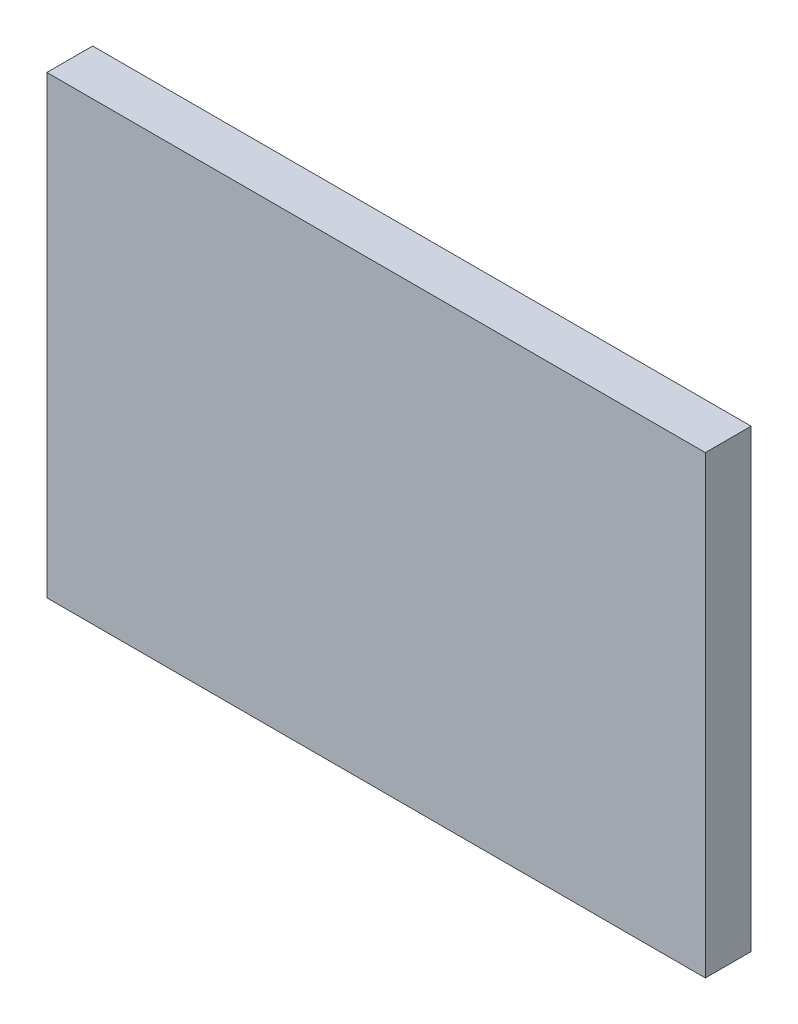
ISO-10303-21;
HEADER;
FILE_DESCRIPTION(('STEP AP214'),'2;1');
FILE_NAME('part.step','',(''),(''),'','','');
FILE_SCHEMA(('AUTOMOTIVE_DESIGN { 1 0 10303 214 1 1 1 1 }'));
ENDSEC;
DATA;
#1=APPLICATION_CONTEXT('core data for automotive mechanical design processes');
#2=APPLICATION_PROTOCOL_DEFINITION('international standard','automotive_design',2000,#1);
#3=PRODUCT_CONTEXT('',#1,'mechanical');
#4=PRODUCT('Part','Part','',(#3));
#5=PRODUCT_RELATED_PRODUCT_CATEGORY('part','',(#4));
#6=PRODUCT_DEFINITION_FORMATION('','',#4);
#7=PRODUCT_DEFINITION_CONTEXT('part definition',#1,'design');
#8=PRODUCT_DEFINITION('design','',#6,#7);
#9=PRODUCT_DEFINITION_SHAPE('','',#8);
#10=(LENGTH_UNIT() NAMED_UNIT(*) SI_UNIT(.MILLI.,.METRE.));
#11=(NAMED_UNIT(*) PLANE_ANGLE_UNIT() SI_UNIT($,.RADIAN.));
#12=(NAMED_UNIT(*) SI_UNIT($,.STERADIAN.) SOLID_ANGLE_UNIT());
#13=UNCERTAINTY_MEASURE_WITH_UNIT(LENGTH_MEASURE(1.E-05),#10,'distance_accuracy_value','');
#14=(GEOMETRIC_REPRESENTATION_CONTEXT(3) GLOBAL_UNCERTAINTY_ASSIGNED_CONTEXT((#13)) GLOBAL_UNIT_ASSIGNED_CONTEXT((#10,
#11,#12)) REPRESENTATION_CONTEXT('',''));
#15=CARTESIAN_POINT('',(0.,0.,0.));
#16=DIRECTION('',(0.,0.,1.));
#17=DIRECTION('',(1.,0.,0.));
#18=AXIS2_PLACEMENT_3D('',#15,#16,#17);
#19=CARTESIAN_POINT('',(-18.7752078077315,18.3648207518248,2.54));
#20=DIRECTION('',(1.,0.,0.));
#21=DIRECTION('',(0.,0.,-1.));
#22=AXIS2_PLACEMENT_3D('',#19,#20,#21);
#23=PLANE('',#22);
#24=DIRECTION('',(0.,-1.,0.));
#25=VECTOR('',#24,1.);
#26=CARTESIAN_POINT('',(-18.7752078077315,18.3648207518248,0.));
#27=LINE('',#26,#25);
#28=CARTESIAN_POINT('',(-18.7752078077315,18.3648207518248,0.));
#29=VERTEX_POINT('',#28);
#30=CARTESIAN_POINT('',(-18.7752078077315,-6.87398318643723,0.));
#31=VERTEX_POINT('',#30);
#32=EDGE_CURVE('E101',#29,#31,#27,.T.);
#33=ORIENTED_EDGE('',*,*,#32,.T.);
#34=DIRECTION('',(0.,0.,-1.));
#35=VECTOR('',#34,1.);
#36=CARTESIAN_POINT('',(-18.7752078077315,-6.87398318643723,2.54));
#37=LINE('',#36,#35);
#38=CARTESIAN_POINT('',(-18.7752078077315,-6.87398318643723,2.54));
#39=VERTEX_POINT('',#38);
#40=EDGE_CURVE('E11',#39,#31,#37,.T.);
#41=ORIENTED_EDGE('',*,*,#40,.F.);
#42=DIRECTION('',(0.,-1.,0.));
#43=VECTOR('',#42,1.);
#44=CARTESIAN_POINT('',(-18.7752078077315,18.3648207518248,2.54));
#45=LINE('',#44,#43);
#46=CARTESIAN_POINT('',(-18.7752078077315,18.3648207518248,2.54));
#47=VERTEX_POINT('',#46);
#48=EDGE_CURVE('E89',#47,#39,#45,.T.);
#49=ORIENTED_EDGE('',*,*,#48,.F.);
#50=DIRECTION('',(0.,0.,-1.));
#51=VECTOR('',#50,1.);
#52=CARTESIAN_POINT('',(-18.7752078077315,18.3648207518248,2.54));
#53=LINE('',#52,#51);
#54=EDGE_CURVE('E97',#47,#29,#53,.T.);
#55=ORIENTED_EDGE('',*,*,#54,.T.);
#56=EDGE_LOOP('',(#33,#41,#49,#55));
#57=FACE_BOUND('',#56,.T.);
#58=ADVANCED_FACE('F38',(#57),#23,.F.);
#59=CARTESIAN_POINT('',(-18.7752078077315,-6.87398318643723,2.54));
#60=DIRECTION('',(0.,1.,0.));
#61=DIRECTION('',(0.,0.,1.));
#62=AXIS2_PLACEMENT_3D('',#59,#60,#61);
#63=PLANE('',#62);
#64=DIRECTION('',(1.,0.,0.));
#65=VECTOR('',#64,1.);
#66=CARTESIAN_POINT('',(-18.7752078077315,-6.87398318643723,0.));
#67=LINE('',#66,#65);
#68=CARTESIAN_POINT('',(17.7492401679648,-6.87398318643723,0.));
#69=VERTEX_POINT('',#68);
#70=EDGE_CURVE('E93',#31,#69,#67,.T.);
#71=ORIENTED_EDGE('',*,*,#70,.T.);
#72=DIRECTION('',(0.,0.,-1.));
#73=VECTOR('',#72,1.);
#74=CARTESIAN_POINT('',(17.7492401679648,-6.87398318643723,2.54));
#75=LINE('',#74,#73);
#76=CARTESIAN_POINT('',(17.7492401679648,-6.87398318643723,2.54));
#77=VERTEX_POINT('',#76);
#78=EDGE_CURVE('E46',#77,#69,#75,.T.);
#79=ORIENTED_EDGE('',*,*,#78,.F.);
#80=DIRECTION('',(1.,0.,0.));
#81=VECTOR('',#80,1.);
#82=CARTESIAN_POINT('',(-18.7752078077315,-6.87398318643723,2.54));
#83=LINE('',#82,#81);
#84=EDGE_CURVE('E84',#39,#77,#83,.T.);
#85=ORIENTED_EDGE('',*,*,#84,.F.);
#86=ORIENTED_EDGE('',*,*,#40,.T.);
#87=EDGE_LOOP('',(#71,#79,#85,#86));
#88=FACE_BOUND('',#87,.T.);
#89=ADVANCED_FACE('F92',(#88),#63,.F.);
#90=CARTESIAN_POINT('',(17.7492401679648,18.3648207518248,2.54));
#91=DIRECTION('',(-1.,0.,0.));
#92=DIRECTION('',(0.,0.,1.));
#93=AXIS2_PLACEMENT_3D('',#90,#91,#92);
#94=PLANE('',#93);
#95=DIRECTION('',(0.,1.,0.));
#96=VECTOR('',#95,1.);
#97=CARTESIAN_POINT('',(17.7492401679648,18.3648207518248,0.));
#98=LINE('',#97,#96);
#99=CARTESIAN_POINT('',(17.7492401679648,18.3648207518248,0.));
#100=VERTEX_POINT('',#99);
#101=EDGE_CURVE('E71',#69,#100,#98,.T.);
#102=ORIENTED_EDGE('',*,*,#101,.T.);
#103=DIRECTION('',(0.,0.,-1.));
#104=VECTOR('',#103,1.);
#105=CARTESIAN_POINT('',(17.7492401679648,18.3648207518248,2.54));
#106=LINE('',#105,#104);
#107=CARTESIAN_POINT('',(17.7492401679648,18.3648207518248,2.54));
#108=VERTEX_POINT('',#107);
#109=EDGE_CURVE('E94',#108,#100,#106,.T.);
#110=ORIENTED_EDGE('',*,*,#109,.F.);
#111=DIRECTION('',(0.,1.,0.));
#112=VECTOR('',#111,1.);
#113=CARTESIAN_POINT('',(17.7492401679648,18.3648207518248,2.54));
#114=LINE('',#113,#112);
#115=EDGE_CURVE('E87',#77,#108,#114,.T.);
#116=ORIENTED_EDGE('',*,*,#115,.F.);
#117=ORIENTED_EDGE('',*,*,#78,.T.);
#118=EDGE_LOOP('',(#102,#110,#116,#117));
#119=FACE_BOUND('',#118,.T.);
#120=ADVANCED_FACE('F95',(#119),#94,.F.);
#121=CARTESIAN_POINT('',(-18.7752078077315,18.3648207518248,2.54));
#122=DIRECTION('',(0.,-1.,0.));
#123=DIRECTION('',(0.,0.,-1.));
#124=AXIS2_PLACEMENT_3D('',#121,#122,#123);
#125=PLANE('',#124);
#126=DIRECTION('',(-1.,0.,0.));
#127=VECTOR('',#126,1.);
#128=CARTESIAN_POINT('',(-18.7752078077315,18.3648207518248,0.));
#129=LINE('',#128,#127);
#130=EDGE_CURVE('E77',#100,#29,#129,.T.);
#131=ORIENTED_EDGE('',*,*,#130,.T.);
#132=ORIENTED_EDGE('',*,*,#54,.F.);
#133=DIRECTION('',(-1.,0.,0.));
#134=VECTOR('',#133,1.);
#135=CARTESIAN_POINT('',(-18.7752078077315,18.3648207518248,2.54));
#136=LINE('',#135,#134);
#137=EDGE_CURVE('E54',#108,#47,#136,.T.);
#138=ORIENTED_EDGE('',*,*,#137,.F.);
#139=ORIENTED_EDGE('',*,*,#109,.T.);
#140=EDGE_LOOP('',(#131,#132,#138,#139));
#141=FACE_BOUND('',#140,.T.);
#142=ADVANCED_FACE('F108',(#141),#125,.F.);
#143=CARTESIAN_POINT('',(0.,0.,2.54));
#144=DIRECTION('',(0.,0.,1.));
#145=DIRECTION('',(1.,0.,0.));
#146=AXIS2_PLACEMENT_3D('',#143,#144,#145);
#147=PLANE('',#146);
#148=ORIENTED_EDGE('',*,*,#48,.T.);
#149=ORIENTED_EDGE('',*,*,#84,.T.);
#150=ORIENTED_EDGE('',*,*,#115,.T.);
#151=ORIENTED_EDGE('',*,*,#137,.T.);
#152=EDGE_LOOP('',(#148,#149,#150,#151));
#153=FACE_BOUND('',#152,.T.);
#154=ADVANCED_FACE('F85',(#153),#147,.T.);
#155=CARTESIAN_POINT('',(0.,0.,0.));
#156=DIRECTION('',(0.,0.,1.));
#157=DIRECTION('',(1.,0.,0.));
#158=AXIS2_PLACEMENT_3D('',#155,#156,#157);
#159=PLANE('',#158);
#160=ORIENTED_EDGE('',*,*,#32,.F.);
#161=ORIENTED_EDGE('',*,*,#130,.F.);
#162=ORIENTED_EDGE('',*,*,#101,.F.);
#163=ORIENTED_EDGE('',*,*,#70,.F.);
#164=EDGE_LOOP('',(#160,#161,#162,#163));
#165=FACE_BOUND('',#164,.T.);
#166=ADVANCED_FACE('F111',(#165),#159,.F.);
#167=CLOSED_SHELL('',(#58,#89,#120,#142,#154,#166));
#168=MANIFOLD_SOLID_BREP('B2',#167);
#169=ADVANCED_BREP_SHAPE_REPRESENTATION('',(#18,#168),#14);
#170=SHAPE_DEFINITION_REPRESENTATION(#9,#169);
ENDSEC;
END-ISO-10303-21;
